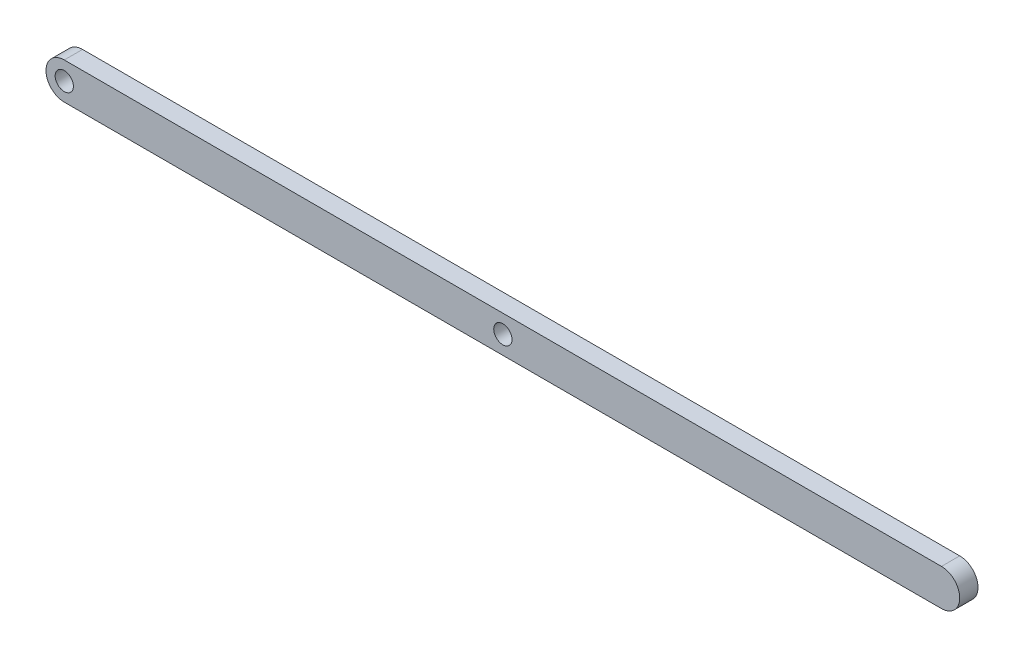
ISO-10303-21;
HEADER;
FILE_DESCRIPTION(('STEP AP214'),'2;1');
FILE_NAME('part.step','',(''),(''),'','','');
FILE_SCHEMA(('AUTOMOTIVE_DESIGN { 1 0 10303 214 1 1 1 1 }'));
ENDSEC;
DATA;
#1=APPLICATION_CONTEXT('core data for automotive mechanical design processes');
#2=APPLICATION_PROTOCOL_DEFINITION('international standard','automotive_design',2000,#1);
#3=PRODUCT_CONTEXT('',#1,'mechanical');
#4=PRODUCT('Part','Part','',(#3));
#5=PRODUCT_RELATED_PRODUCT_CATEGORY('part','',(#4));
#6=PRODUCT_DEFINITION_FORMATION('','',#4);
#7=PRODUCT_DEFINITION_CONTEXT('part definition',#1,'design');
#8=PRODUCT_DEFINITION('design','',#6,#7);
#9=PRODUCT_DEFINITION_SHAPE('','',#8);
#10=(LENGTH_UNIT() NAMED_UNIT(*) SI_UNIT(.MILLI.,.METRE.));
#11=(NAMED_UNIT(*) PLANE_ANGLE_UNIT() SI_UNIT($,.RADIAN.));
#12=(NAMED_UNIT(*) SI_UNIT($,.STERADIAN.) SOLID_ANGLE_UNIT());
#13=UNCERTAINTY_MEASURE_WITH_UNIT(LENGTH_MEASURE(1.E-05),#10,'distance_accuracy_value','');
#14=(GEOMETRIC_REPRESENTATION_CONTEXT(3) GLOBAL_UNCERTAINTY_ASSIGNED_CONTEXT((#13)) GLOBAL_UNIT_ASSIGNED_CONTEXT((#10,
#11,#12)) REPRESENTATION_CONTEXT('',''));
#15=CARTESIAN_POINT('',(0.,0.,0.));
#16=DIRECTION('',(0.,0.,1.));
#17=DIRECTION('',(1.,0.,0.));
#18=AXIS2_PLACEMENT_3D('',#15,#16,#17);
#19=CARTESIAN_POINT('',(-152.4,0.,6.35));
#20=DIRECTION('',(0.,0.,1.));
#21=DIRECTION('',(1.,0.,0.));
#22=AXIS2_PLACEMENT_3D('',#19,#20,#21);
#23=PLANE('',#22);
#24=CARTESIAN_POINT('',(0.,0.,6.35));
#25=DIRECTION('',(0.,0.,1.));
#26=DIRECTION('',(1.,0.,0.));
#27=AXIS2_PLACEMENT_3D('',#24,#25,#26);
#28=CIRCLE('',#27,3.175);
#29=CARTESIAN_POINT('',(3.17499999999994,0.,6.35));
#30=VERTEX_POINT('',#29);
#31=EDGE_CURVE('E102',#30,#30,#28,.T.);
#32=ORIENTED_EDGE('',*,*,#31,.F.);
#33=EDGE_LOOP('',(#32));
#34=FACE_BOUND('',#33,.T.);
#35=CARTESIAN_POINT('',(-152.4,0.,6.35));
#36=DIRECTION('',(0.,0.,1.));
#37=DIRECTION('',(1.,0.,0.));
#38=AXIS2_PLACEMENT_3D('',#35,#36,#37);
#39=CIRCLE('',#38,6.35000000000006);
#40=CARTESIAN_POINT('',(-152.4,6.35000000000006,6.35));
#41=VERTEX_POINT('',#40);
#42=CARTESIAN_POINT('',(-152.4,-6.35000000000006,6.35));
#43=VERTEX_POINT('',#42);
#44=EDGE_CURVE('E87',#41,#43,#39,.T.);
#45=ORIENTED_EDGE('',*,*,#44,.T.);
#46=DIRECTION('',(1.,0.,0.));
#47=VECTOR('',#46,1.);
#48=CARTESIAN_POINT('',(-152.4,-6.35000000000006,6.35));
#49=LINE('',#48,#47);
#50=CARTESIAN_POINT('',(152.4,-6.35,6.35));
#51=VERTEX_POINT('',#50);
#52=EDGE_CURVE('E82',#43,#51,#49,.T.);
#53=ORIENTED_EDGE('',*,*,#52,.T.);
#54=CARTESIAN_POINT('',(152.4,0.,6.35));
#55=DIRECTION('',(0.,0.,1.));
#56=DIRECTION('',(1.,0.,0.));
#57=AXIS2_PLACEMENT_3D('',#54,#55,#56);
#58=CIRCLE('',#57,6.35000000000006);
#59=CARTESIAN_POINT('',(152.4,6.35000000000011,6.35));
#60=VERTEX_POINT('',#59);
#61=EDGE_CURVE('E85',#51,#60,#58,.T.);
#62=ORIENTED_EDGE('',*,*,#61,.T.);
#63=DIRECTION('',(-1.,0.,0.));
#64=VECTOR('',#63,1.);
#65=CARTESIAN_POINT('',(-152.4,6.35000000000006,6.35));
#66=LINE('',#65,#64);
#67=EDGE_CURVE('E52',#60,#41,#66,.T.);
#68=ORIENTED_EDGE('',*,*,#67,.T.);
#69=EDGE_LOOP('',(#45,#53,#62,#68));
#70=FACE_BOUND('',#69,.T.);
#71=CARTESIAN_POINT('',(-152.4,0.,6.35));
#72=DIRECTION('',(0.,0.,1.));
#73=DIRECTION('',(1.,0.,0.));
#74=AXIS2_PLACEMENT_3D('',#71,#72,#73);
#75=CIRCLE('',#74,3.175);
#76=CARTESIAN_POINT('',(-149.225,0.,6.35));
#77=VERTEX_POINT('',#76);
#78=EDGE_CURVE('E117',#77,#77,#75,.T.);
#79=ORIENTED_EDGE('',*,*,#78,.F.);
#80=EDGE_LOOP('',(#79));
#81=FACE_BOUND('',#80,.T.);
#82=ADVANCED_FACE('F35',(#34,#70,#81),#23,.T.);
#83=CARTESIAN_POINT('',(-152.4,0.,0.));
#84=DIRECTION('',(0.,0.,1.));
#85=DIRECTION('',(1.,0.,0.));
#86=AXIS2_PLACEMENT_3D('',#83,#84,#85);
#87=PLANE('',#86);
#88=CARTESIAN_POINT('',(-152.4,0.,0.));
#89=DIRECTION('',(0.,0.,1.));
#90=DIRECTION('',(1.,0.,0.));
#91=AXIS2_PLACEMENT_3D('',#88,#89,#90);
#92=CIRCLE('',#91,6.35000000000006);
#93=CARTESIAN_POINT('',(-152.4,6.35000000000006,0.));
#94=VERTEX_POINT('',#93);
#95=CARTESIAN_POINT('',(-152.4,-6.35000000000006,0.));
#96=VERTEX_POINT('',#95);
#97=EDGE_CURVE('E99',#94,#96,#92,.T.);
#98=ORIENTED_EDGE('',*,*,#97,.F.);
#99=DIRECTION('',(-1.,0.,0.));
#100=VECTOR('',#99,1.);
#101=CARTESIAN_POINT('',(-152.4,6.35000000000006,0.));
#102=LINE('',#101,#100);
#103=CARTESIAN_POINT('',(152.4,6.35000000000011,0.));
#104=VERTEX_POINT('',#103);
#105=EDGE_CURVE('E75',#104,#94,#102,.T.);
#106=ORIENTED_EDGE('',*,*,#105,.F.);
#107=CARTESIAN_POINT('',(152.4,0.,0.));
#108=DIRECTION('',(0.,0.,1.));
#109=DIRECTION('',(1.,0.,0.));
#110=AXIS2_PLACEMENT_3D('',#107,#108,#109);
#111=CIRCLE('',#110,6.35000000000006);
#112=CARTESIAN_POINT('',(152.4,-6.35,0.));
#113=VERTEX_POINT('',#112);
#114=EDGE_CURVE('E69',#113,#104,#111,.T.);
#115=ORIENTED_EDGE('',*,*,#114,.F.);
#116=DIRECTION('',(1.,0.,0.));
#117=VECTOR('',#116,1.);
#118=CARTESIAN_POINT('',(-152.4,-6.35000000000006,0.));
#119=LINE('',#118,#117);
#120=EDGE_CURVE('E91',#96,#113,#119,.T.);
#121=ORIENTED_EDGE('',*,*,#120,.F.);
#122=EDGE_LOOP('',(#98,#106,#115,#121));
#123=FACE_BOUND('',#122,.T.);
#124=CARTESIAN_POINT('',(0.,0.,0.));
#125=DIRECTION('',(0.,0.,1.));
#126=DIRECTION('',(1.,0.,0.));
#127=AXIS2_PLACEMENT_3D('',#124,#125,#126);
#128=CIRCLE('',#127,3.175);
#129=CARTESIAN_POINT('',(3.17499999999994,0.,0.));
#130=VERTEX_POINT('',#129);
#131=EDGE_CURVE('E114',#130,#130,#128,.T.);
#132=ORIENTED_EDGE('',*,*,#131,.T.);
#133=EDGE_LOOP('',(#132));
#134=FACE_BOUND('',#133,.T.);
#135=CARTESIAN_POINT('',(-152.4,0.,0.));
#136=DIRECTION('',(0.,0.,1.));
#137=DIRECTION('',(1.,0.,0.));
#138=AXIS2_PLACEMENT_3D('',#135,#136,#137);
#139=CIRCLE('',#138,3.175);
#140=CARTESIAN_POINT('',(-149.225,0.,0.));
#141=VERTEX_POINT('',#140);
#142=EDGE_CURVE('E120',#141,#141,#139,.T.);
#143=ORIENTED_EDGE('',*,*,#142,.T.);
#144=EDGE_LOOP('',(#143));
#145=FACE_BOUND('',#144,.T.);
#146=ADVANCED_FACE('F110',(#123,#134,#145),#87,.F.);
#147=CARTESIAN_POINT('',(-152.4,0.,6.35));
#148=DIRECTION('',(0.,0.,-1.));
#149=DIRECTION('',(-1.,0.,0.));
#150=AXIS2_PLACEMENT_3D('',#147,#148,#149);
#151=CYLINDRICAL_SURFACE('',#150,6.35000000000006);
#152=ORIENTED_EDGE('',*,*,#97,.T.);
#153=DIRECTION('',(0.,0.,-1.));
#154=VECTOR('',#153,1.);
#155=CARTESIAN_POINT('',(-152.4,-6.35000000000006,6.35));
#156=LINE('',#155,#154);
#157=EDGE_CURVE('E11',#43,#96,#156,.T.);
#158=ORIENTED_EDGE('',*,*,#157,.F.);
#159=ORIENTED_EDGE('',*,*,#44,.F.);
#160=DIRECTION('',(0.,0.,-1.));
#161=VECTOR('',#160,1.);
#162=CARTESIAN_POINT('',(-152.4,6.35000000000006,6.35));
#163=LINE('',#162,#161);
#164=EDGE_CURVE('E95',#41,#94,#163,.T.);
#165=ORIENTED_EDGE('',*,*,#164,.T.);
#166=EDGE_LOOP('',(#152,#158,#159,#165));
#167=FACE_BOUND('',#166,.T.);
#168=ADVANCED_FACE('F37',(#167),#151,.T.);
#169=CARTESIAN_POINT('',(-152.4,-6.35000000000006,6.35));
#170=DIRECTION('',(0.,1.,0.));
#171=DIRECTION('',(-1.,0.,0.));
#172=AXIS2_PLACEMENT_3D('',#169,#170,#171);
#173=PLANE('',#172);
#174=ORIENTED_EDGE('',*,*,#120,.T.);
#175=DIRECTION('',(0.,0.,-1.));
#176=VECTOR('',#175,1.);
#177=CARTESIAN_POINT('',(152.4,-6.35,6.35));
#178=LINE('',#177,#176);
#179=EDGE_CURVE('E44',#51,#113,#178,.T.);
#180=ORIENTED_EDGE('',*,*,#179,.F.);
#181=ORIENTED_EDGE('',*,*,#52,.F.);
#182=ORIENTED_EDGE('',*,*,#157,.T.);
#183=EDGE_LOOP('',(#174,#180,#181,#182));
#184=FACE_BOUND('',#183,.T.);
#185=ADVANCED_FACE('F90',(#184),#173,.F.);
#186=CARTESIAN_POINT('',(152.4,0.,6.35));
#187=DIRECTION('',(0.,0.,-1.));
#188=DIRECTION('',(-1.,0.,0.));
#189=AXIS2_PLACEMENT_3D('',#186,#187,#188);
#190=CYLINDRICAL_SURFACE('',#189,6.35000000000006);
#191=ORIENTED_EDGE('',*,*,#114,.T.);
#192=DIRECTION('',(0.,0.,-1.));
#193=VECTOR('',#192,1.);
#194=CARTESIAN_POINT('',(152.4,6.35000000000011,6.35));
#195=LINE('',#194,#193);
#196=EDGE_CURVE('E92',#60,#104,#195,.T.);
#197=ORIENTED_EDGE('',*,*,#196,.F.);
#198=ORIENTED_EDGE('',*,*,#61,.F.);
#199=ORIENTED_EDGE('',*,*,#179,.T.);
#200=EDGE_LOOP('',(#191,#197,#198,#199));
#201=FACE_BOUND('',#200,.T.);
#202=ADVANCED_FACE('F93',(#201),#190,.T.);
#203=CARTESIAN_POINT('',(-152.4,6.35000000000006,6.35));
#204=DIRECTION('',(0.,-1.,0.));
#205=DIRECTION('',(1.,0.,0.));
#206=AXIS2_PLACEMENT_3D('',#203,#204,#205);
#207=PLANE('',#206);
#208=ORIENTED_EDGE('',*,*,#105,.T.);
#209=ORIENTED_EDGE('',*,*,#164,.F.);
#210=ORIENTED_EDGE('',*,*,#67,.F.);
#211=ORIENTED_EDGE('',*,*,#196,.T.);
#212=EDGE_LOOP('',(#208,#209,#210,#211));
#213=FACE_BOUND('',#212,.T.);
#214=ADVANCED_FACE('F107',(#213),#207,.F.);
#215=CARTESIAN_POINT('',(0.,0.,6.35));
#216=DIRECTION('',(0.,0.,-1.));
#217=DIRECTION('',(-1.,0.,0.));
#218=AXIS2_PLACEMENT_3D('',#215,#216,#217);
#219=CYLINDRICAL_SURFACE('',#218,3.175);
#220=ORIENTED_EDGE('',*,*,#31,.T.);
#221=EDGE_LOOP('',(#220));
#222=FACE_BOUND('',#221,.T.);
#223=ORIENTED_EDGE('',*,*,#131,.F.);
#224=EDGE_LOOP('',(#223));
#225=FACE_BOUND('',#224,.T.);
#226=ADVANCED_FACE('F137',(#222,#225),#219,.F.);
#227=CARTESIAN_POINT('',(-152.4,0.,6.35));
#228=DIRECTION('',(0.,0.,-1.));
#229=DIRECTION('',(-1.,0.,0.));
#230=AXIS2_PLACEMENT_3D('',#227,#228,#229);
#231=CYLINDRICAL_SURFACE('',#230,3.175);
#232=ORIENTED_EDGE('',*,*,#78,.T.);
#233=EDGE_LOOP('',(#232));
#234=FACE_BOUND('',#233,.T.);
#235=ORIENTED_EDGE('',*,*,#142,.F.);
#236=EDGE_LOOP('',(#235));
#237=FACE_BOUND('',#236,.T.);
#238=ADVANCED_FACE('F126',(#234,#237),#231,.F.);
#239=CLOSED_SHELL('',(#82,#146,#168,#185,#202,#214,#226,#238));
#240=MANIFOLD_SOLID_BREP('B2',#239);
#241=ADVANCED_BREP_SHAPE_REPRESENTATION('',(#18,#240),#14);
#242=SHAPE_DEFINITION_REPRESENTATION(#9,#241);
ENDSEC;
END-ISO-10303-21;
